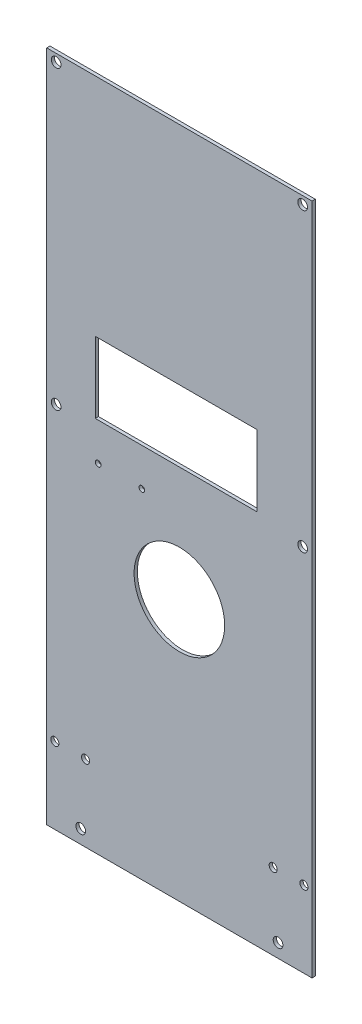
ISO-10303-21;
HEADER;
FILE_DESCRIPTION(('STEP AP214'),'2;1');
FILE_NAME('part.step','',(''),(''),'','','');
FILE_SCHEMA(('AUTOMOTIVE_DESIGN { 1 0 10303 214 1 1 1 1 }'));
ENDSEC;
DATA;
#1=APPLICATION_CONTEXT('core data for automotive mechanical design processes');
#2=APPLICATION_PROTOCOL_DEFINITION('international standard','automotive_design',2000,#1);
#3=PRODUCT_CONTEXT('',#1,'mechanical');
#4=PRODUCT('Part','Part','',(#3));
#5=PRODUCT_RELATED_PRODUCT_CATEGORY('part','',(#4));
#6=PRODUCT_DEFINITION_FORMATION('','',#4);
#7=PRODUCT_DEFINITION_CONTEXT('part definition',#1,'design');
#8=PRODUCT_DEFINITION('design','',#6,#7);
#9=PRODUCT_DEFINITION_SHAPE('','',#8);
#10=(LENGTH_UNIT() NAMED_UNIT(*) SI_UNIT(.MILLI.,.METRE.));
#11=(NAMED_UNIT(*) PLANE_ANGLE_UNIT() SI_UNIT($,.RADIAN.));
#12=(NAMED_UNIT(*) SI_UNIT($,.STERADIAN.) SOLID_ANGLE_UNIT());
#13=UNCERTAINTY_MEASURE_WITH_UNIT(LENGTH_MEASURE(1.E-05),#10,'distance_accuracy_value','');
#14=(GEOMETRIC_REPRESENTATION_CONTEXT(3) GLOBAL_UNCERTAINTY_ASSIGNED_CONTEXT((#13)) GLOBAL_UNIT_ASSIGNED_CONTEXT((#10,
#11,#12)) REPRESENTATION_CONTEXT('',''));
#15=CARTESIAN_POINT('',(0.,0.,0.));
#16=DIRECTION('',(0.,0.,1.));
#17=DIRECTION('',(1.,0.,0.));
#18=AXIS2_PLACEMENT_3D('',#15,#16,#17);
#19=CARTESIAN_POINT('',(-41.,-104.,1.));
#20=DIRECTION('',(1.,0.,0.));
#21=DIRECTION('',(0.,0.,-1.));
#22=AXIS2_PLACEMENT_3D('',#19,#20,#21);
#23=PLANE('',#22);
#24=DIRECTION('',(0.,-1.,0.));
#25=VECTOR('',#24,1.);
#26=CARTESIAN_POINT('',(-41.,-104.,0.));
#27=LINE('',#26,#25);
#28=CARTESIAN_POINT('',(-41.,104.,0.));
#29=VERTEX_POINT('',#28);
#30=CARTESIAN_POINT('',(-41.,-104.,0.));
#31=VERTEX_POINT('',#30);
#32=EDGE_CURVE('E167',#29,#31,#27,.T.);
#33=ORIENTED_EDGE('',*,*,#32,.T.);
#34=DIRECTION('',(0.,0.,-1.));
#35=VECTOR('',#34,1.);
#36=CARTESIAN_POINT('',(-41.,-104.,1.));
#37=LINE('',#36,#35);
#38=CARTESIAN_POINT('',(-41.,-104.,1.));
#39=VERTEX_POINT('',#38);
#40=EDGE_CURVE('E194',#39,#31,#37,.T.);
#41=ORIENTED_EDGE('',*,*,#40,.F.);
#42=DIRECTION('',(0.,-1.,0.));
#43=VECTOR('',#42,1.);
#44=CARTESIAN_POINT('',(-41.,-104.,1.));
#45=LINE('',#44,#43);
#46=CARTESIAN_POINT('',(-41.,104.,1.));
#47=VERTEX_POINT('',#46);
#48=EDGE_CURVE('E168',#47,#39,#45,.T.);
#49=ORIENTED_EDGE('',*,*,#48,.F.);
#50=DIRECTION('',(0.,0.,-1.));
#51=VECTOR('',#50,1.);
#52=CARTESIAN_POINT('',(-41.,104.,1.));
#53=LINE('',#52,#51);
#54=EDGE_CURVE('E178',#47,#29,#53,.T.);
#55=ORIENTED_EDGE('',*,*,#54,.T.);
#56=EDGE_LOOP('',(#33,#41,#49,#55));
#57=FACE_BOUND('',#56,.T.);
#58=ADVANCED_FACE('F35',(#57),#23,.F.);
#59=CARTESIAN_POINT('',(41.,-104.,1.));
#60=DIRECTION('',(0.,1.,0.));
#61=DIRECTION('',(-1.,0.,0.));
#62=AXIS2_PLACEMENT_3D('',#59,#60,#61);
#63=PLANE('',#62);
#64=DIRECTION('',(1.,0.,0.));
#65=VECTOR('',#64,1.);
#66=CARTESIAN_POINT('',(41.,-104.,0.));
#67=LINE('',#66,#65);
#68=CARTESIAN_POINT('',(41.,-104.,0.));
#69=VERTEX_POINT('',#68);
#70=EDGE_CURVE('E181',#31,#69,#67,.T.);
#71=ORIENTED_EDGE('',*,*,#70,.T.);
#72=DIRECTION('',(0.,0.,-1.));
#73=VECTOR('',#72,1.);
#74=CARTESIAN_POINT('',(41.,-104.,1.));
#75=LINE('',#74,#73);
#76=CARTESIAN_POINT('',(41.,-104.,1.));
#77=VERTEX_POINT('',#76);
#78=EDGE_CURVE('E191',#77,#69,#75,.T.);
#79=ORIENTED_EDGE('',*,*,#78,.F.);
#80=DIRECTION('',(1.,0.,0.));
#81=VECTOR('',#80,1.);
#82=CARTESIAN_POINT('',(41.,-104.,1.));
#83=LINE('',#82,#81);
#84=EDGE_CURVE('E171',#39,#77,#83,.T.);
#85=ORIENTED_EDGE('',*,*,#84,.F.);
#86=ORIENTED_EDGE('',*,*,#40,.T.);
#87=EDGE_LOOP('',(#71,#79,#85,#86));
#88=FACE_BOUND('',#87,.T.);
#89=ADVANCED_FACE('F222',(#88),#63,.F.);
#90=CARTESIAN_POINT('',(41.,-104.,1.));
#91=DIRECTION('',(-1.,0.,0.));
#92=DIRECTION('',(0.,0.,1.));
#93=AXIS2_PLACEMENT_3D('',#90,#91,#92);
#94=PLANE('',#93);
#95=DIRECTION('',(0.,1.,0.));
#96=VECTOR('',#95,1.);
#97=CARTESIAN_POINT('',(41.,-104.,0.));
#98=LINE('',#97,#96);
#99=CARTESIAN_POINT('',(41.,104.,0.));
#100=VERTEX_POINT('',#99);
#101=EDGE_CURVE('E183',#69,#100,#98,.T.);
#102=ORIENTED_EDGE('',*,*,#101,.T.);
#103=DIRECTION('',(0.,0.,-1.));
#104=VECTOR('',#103,1.);
#105=CARTESIAN_POINT('',(41.,104.,1.));
#106=LINE('',#105,#104);
#107=CARTESIAN_POINT('',(41.,104.,1.));
#108=VERTEX_POINT('',#107);
#109=EDGE_CURVE('E188',#108,#100,#106,.T.);
#110=ORIENTED_EDGE('',*,*,#109,.F.);
#111=DIRECTION('',(0.,1.,0.));
#112=VECTOR('',#111,1.);
#113=CARTESIAN_POINT('',(41.,-104.,1.));
#114=LINE('',#113,#112);
#115=EDGE_CURVE('E174',#77,#108,#114,.T.);
#116=ORIENTED_EDGE('',*,*,#115,.F.);
#117=ORIENTED_EDGE('',*,*,#78,.T.);
#118=EDGE_LOOP('',(#102,#110,#116,#117));
#119=FACE_BOUND('',#118,.T.);
#120=ADVANCED_FACE('F227',(#119),#94,.F.);
#121=CARTESIAN_POINT('',(41.,104.,1.));
#122=DIRECTION('',(0.,-1.,0.));
#123=DIRECTION('',(0.,0.,-1.));
#124=AXIS2_PLACEMENT_3D('',#121,#122,#123);
#125=PLANE('',#124);
#126=DIRECTION('',(-1.,0.,0.));
#127=VECTOR('',#126,1.);
#128=CARTESIAN_POINT('',(41.,104.,0.));
#129=LINE('',#128,#127);
#130=EDGE_CURVE('E172',#100,#29,#129,.T.);
#131=ORIENTED_EDGE('',*,*,#130,.T.);
#132=ORIENTED_EDGE('',*,*,#54,.F.);
#133=DIRECTION('',(-1.,0.,0.));
#134=VECTOR('',#133,1.);
#135=CARTESIAN_POINT('',(41.,104.,1.));
#136=LINE('',#135,#134);
#137=EDGE_CURVE('E176',#108,#47,#136,.T.);
#138=ORIENTED_EDGE('',*,*,#137,.F.);
#139=ORIENTED_EDGE('',*,*,#109,.T.);
#140=EDGE_LOOP('',(#131,#132,#138,#139));
#141=FACE_BOUND('',#140,.T.);
#142=ADVANCED_FACE('F242',(#141),#125,.F.);
#143=CARTESIAN_POINT('',(0.,0.,1.));
#144=DIRECTION('',(0.,0.,1.));
#145=DIRECTION('',(1.,0.,0.));
#146=AXIS2_PLACEMENT_3D('',#143,#144,#145);
#147=PLANE('',#146);
#148=CARTESIAN_POINT('',(-25.1,0.649999999999291,1.));
#149=DIRECTION('',(0.,0.,1.));
#150=DIRECTION('',(1.,0.,0.));
#151=AXIS2_PLACEMENT_3D('',#148,#149,#150);
#152=CIRCLE('',#151,0.874999999999987);
#153=CARTESIAN_POINT('',(-24.225,0.649999999999291,1.));
#154=VERTEX_POINT('',#153);
#155=EDGE_CURVE('E426',#154,#154,#152,.T.);
#156=ORIENTED_EDGE('',*,*,#155,.F.);
#157=EDGE_LOOP('',(#156));
#158=FACE_BOUND('',#157,.T.);
#159=CARTESIAN_POINT('',(-11.6,0.649999999999292,1.));
#160=DIRECTION('',(0.,0.,1.));
#161=DIRECTION('',(1.,0.,0.));
#162=AXIS2_PLACEMENT_3D('',#159,#160,#161);
#163=CIRCLE('',#162,0.874999999999987);
#164=CARTESIAN_POINT('',(-10.725,0.649999999999292,1.));
#165=VERTEX_POINT('',#164);
#166=EDGE_CURVE('E428',#165,#165,#163,.T.);
#167=ORIENTED_EDGE('',*,*,#166,.F.);
#168=EDGE_LOOP('',(#167));
#169=FACE_BOUND('',#168,.T.);
#170=CARTESIAN_POINT('',(-38.4999999999999,-80.4027964934749,1.));
#171=DIRECTION('',(0.,0.,1.));
#172=DIRECTION('',(1.,0.,0.));
#173=AXIS2_PLACEMENT_3D('',#170,#171,#172);
#174=CIRCLE('',#173,1.24999999999999);
#175=CARTESIAN_POINT('',(-37.25,-80.4027964934749,1.));
#176=VERTEX_POINT('',#175);
#177=EDGE_CURVE('E436',#176,#176,#174,.T.);
#178=ORIENTED_EDGE('',*,*,#177,.F.);
#179=EDGE_LOOP('',(#178));
#180=FACE_BOUND('',#179,.T.);
#181=CARTESIAN_POINT('',(-28.9999999999999,-80.4027964934749,1.));
#182=DIRECTION('',(0.,0.,1.));
#183=DIRECTION('',(1.,0.,0.));
#184=AXIS2_PLACEMENT_3D('',#181,#182,#183);
#185=CIRCLE('',#184,1.24999999999999);
#186=CARTESIAN_POINT('',(-27.7499999999999,-80.4027964934749,1.));
#187=VERTEX_POINT('',#186);
#188=EDGE_CURVE('E442',#187,#187,#185,.T.);
#189=ORIENTED_EDGE('',*,*,#188,.F.);
#190=EDGE_LOOP('',(#189));
#191=FACE_BOUND('',#190,.T.);
#192=CARTESIAN_POINT('',(29.0000000000001,-80.4027964934749,1.));
#193=DIRECTION('',(0.,0.,1.));
#194=DIRECTION('',(1.,0.,0.));
#195=AXIS2_PLACEMENT_3D('',#192,#193,#194);
#196=CIRCLE('',#195,1.24999999999999);
#197=CARTESIAN_POINT('',(30.2500000000001,-80.4027964934749,1.));
#198=VERTEX_POINT('',#197);
#199=EDGE_CURVE('E448',#198,#198,#196,.T.);
#200=ORIENTED_EDGE('',*,*,#199,.F.);
#201=EDGE_LOOP('',(#200));
#202=FACE_BOUND('',#201,.T.);
#203=CARTESIAN_POINT('',(38.5000000000001,-80.4027964934749,1.));
#204=DIRECTION('',(0.,0.,1.));
#205=DIRECTION('',(1.,0.,0.));
#206=AXIS2_PLACEMENT_3D('',#203,#204,#205);
#207=CIRCLE('',#206,1.24999999999999);
#208=CARTESIAN_POINT('',(39.7500000000001,-80.4027964934749,1.));
#209=VERTEX_POINT('',#208);
#210=EDGE_CURVE('E454',#209,#209,#207,.T.);
#211=ORIENTED_EDGE('',*,*,#210,.F.);
#212=EDGE_LOOP('',(#211));
#213=FACE_BOUND('',#212,.T.);
#214=DIRECTION('',(0.,-1.,0.));
#215=VECTOR('',#214,1.);
#216=CARTESIAN_POINT('',(-26.,12.3,1.));
#217=LINE('',#216,#215);
#218=CARTESIAN_POINT('',(-26.,34.3,1.));
#219=VERTEX_POINT('',#218);
#220=CARTESIAN_POINT('',(-26.,12.3,1.));
#221=VERTEX_POINT('',#220);
#222=EDGE_CURVE('E49',#219,#221,#217,.T.);
#223=ORIENTED_EDGE('',*,*,#222,.F.);
#224=DIRECTION('',(-1.,0.,0.));
#225=VECTOR('',#224,1.);
#226=CARTESIAN_POINT('',(-26.,34.3,1.));
#227=LINE('',#226,#225);
#228=CARTESIAN_POINT('',(24.,34.3,1.));
#229=VERTEX_POINT('',#228);
#230=EDGE_CURVE('E118',#229,#219,#227,.T.);
#231=ORIENTED_EDGE('',*,*,#230,.F.);
#232=DIRECTION('',(0.,1.,0.));
#233=VECTOR('',#232,1.);
#234=CARTESIAN_POINT('',(24.,12.3,1.));
#235=LINE('',#234,#233);
#236=CARTESIAN_POINT('',(24.,12.3,1.));
#237=VERTEX_POINT('',#236);
#238=EDGE_CURVE('E102',#237,#229,#235,.T.);
#239=ORIENTED_EDGE('',*,*,#238,.F.);
#240=DIRECTION('',(1.,0.,0.));
#241=VECTOR('',#240,1.);
#242=CARTESIAN_POINT('',(-26.,12.3,1.));
#243=LINE('',#242,#241);
#244=EDGE_CURVE('E111',#221,#237,#243,.T.);
#245=ORIENTED_EDGE('',*,*,#244,.F.);
#246=EDGE_LOOP('',(#223,#231,#239,#245));
#247=FACE_BOUND('',#246,.T.);
#248=CARTESIAN_POINT('',(6.34145513878082E-11,-23.1500000000007,1.));
#249=DIRECTION('',(0.,0.,1.));
#250=DIRECTION('',(1.,0.,0.));
#251=AXIS2_PLACEMENT_3D('',#248,#249,#250);
#252=CIRCLE('',#251,14.);
#253=CARTESIAN_POINT('',(14.0000000000634,-23.1500000000007,1.));
#254=VERTEX_POINT('',#253);
#255=EDGE_CURVE('E125',#254,#254,#252,.T.);
#256=ORIENTED_EDGE('',*,*,#255,.F.);
#257=EDGE_LOOP('',(#256));
#258=FACE_BOUND('',#257,.T.);
#259=CARTESIAN_POINT('',(-38.1,9.9999999999993,1.));
#260=DIRECTION('',(0.,0.,1.));
#261=DIRECTION('',(1.,0.,0.));
#262=AXIS2_PLACEMENT_3D('',#259,#260,#261);
#263=CIRCLE('',#262,1.5);
#264=CARTESIAN_POINT('',(-36.6,9.9999999999993,1.));
#265=VERTEX_POINT('',#264);
#266=EDGE_CURVE('E131',#265,#265,#263,.T.);
#267=ORIENTED_EDGE('',*,*,#266,.F.);
#268=EDGE_LOOP('',(#267));
#269=FACE_BOUND('',#268,.T.);
#270=CARTESIAN_POINT('',(38.1,9.99999999999927,1.));
#271=DIRECTION('',(0.,0.,1.));
#272=DIRECTION('',(1.,0.,0.));
#273=AXIS2_PLACEMENT_3D('',#270,#271,#272);
#274=CIRCLE('',#273,1.5);
#275=CARTESIAN_POINT('',(39.6,9.99999999999927,1.));
#276=VERTEX_POINT('',#275);
#277=EDGE_CURVE('E137',#276,#276,#274,.T.);
#278=ORIENTED_EDGE('',*,*,#277,.F.);
#279=EDGE_LOOP('',(#278));
#280=FACE_BOUND('',#279,.T.);
#281=CARTESIAN_POINT('',(30.5000000000074,-99.75,1.));
#282=DIRECTION('',(0.,0.,1.));
#283=DIRECTION('',(1.,0.,0.));
#284=AXIS2_PLACEMENT_3D('',#281,#282,#283);
#285=CIRCLE('',#284,1.5);
#286=CARTESIAN_POINT('',(32.0000000000074,-99.75,1.));
#287=VERTEX_POINT('',#286);
#288=EDGE_CURVE('E143',#287,#287,#285,.T.);
#289=ORIENTED_EDGE('',*,*,#288,.F.);
#290=EDGE_LOOP('',(#289));
#291=FACE_BOUND('',#290,.T.);
#292=CARTESIAN_POINT('',(-30.4999999999927,-99.7499999999999,1.));
#293=DIRECTION('',(0.,0.,1.));
#294=DIRECTION('',(1.,0.,0.));
#295=AXIS2_PLACEMENT_3D('',#292,#293,#294);
#296=CIRCLE('',#295,1.5);
#297=CARTESIAN_POINT('',(-28.9999999999927,-99.7499999999999,1.));
#298=VERTEX_POINT('',#297);
#299=EDGE_CURVE('E149',#298,#298,#296,.T.);
#300=ORIENTED_EDGE('',*,*,#299,.F.);
#301=EDGE_LOOP('',(#300));
#302=FACE_BOUND('',#301,.T.);
#303=CARTESIAN_POINT('',(-38.1,101.599999679999,1.));
#304=DIRECTION('',(0.,0.,1.));
#305=DIRECTION('',(1.,0.,0.));
#306=AXIS2_PLACEMENT_3D('',#303,#304,#305);
#307=CIRCLE('',#306,1.5);
#308=CARTESIAN_POINT('',(-36.6,101.599999679999,1.));
#309=VERTEX_POINT('',#308);
#310=EDGE_CURVE('E155',#309,#309,#307,.T.);
#311=ORIENTED_EDGE('',*,*,#310,.F.);
#312=EDGE_LOOP('',(#311));
#313=FACE_BOUND('',#312,.T.);
#314=CARTESIAN_POINT('',(38.1,101.599999679999,1.));
#315=DIRECTION('',(0.,0.,1.));
#316=DIRECTION('',(1.,0.,0.));
#317=AXIS2_PLACEMENT_3D('',#314,#315,#316);
#318=CIRCLE('',#317,1.5);
#319=CARTESIAN_POINT('',(39.6,101.599999679999,1.));
#320=VERTEX_POINT('',#319);
#321=EDGE_CURVE('E161',#320,#320,#318,.T.);
#322=ORIENTED_EDGE('',*,*,#321,.F.);
#323=EDGE_LOOP('',(#322));
#324=FACE_BOUND('',#323,.T.);
#325=ORIENTED_EDGE('',*,*,#48,.T.);
#326=ORIENTED_EDGE('',*,*,#84,.T.);
#327=ORIENTED_EDGE('',*,*,#115,.T.);
#328=ORIENTED_EDGE('',*,*,#137,.T.);
#329=EDGE_LOOP('',(#325,#326,#327,#328));
#330=FACE_BOUND('',#329,.T.);
#331=ADVANCED_FACE('F115',(#158,#169,#180,#191,#202,#213,#247,#258,#269,#280,#291,#302,#313,
#324,#330),#147,.T.);
#332=CARTESIAN_POINT('',(0.,0.,0.));
#333=DIRECTION('',(0.,0.,1.));
#334=DIRECTION('',(1.,0.,0.));
#335=AXIS2_PLACEMENT_3D('',#332,#333,#334);
#336=PLANE('',#335);
#337=CARTESIAN_POINT('',(-25.1,0.649999999999291,0.));
#338=DIRECTION('',(0.,0.,1.));
#339=DIRECTION('',(1.,0.,0.));
#340=AXIS2_PLACEMENT_3D('',#337,#338,#339);
#341=CIRCLE('',#340,0.874999999999997);
#342=CARTESIAN_POINT('',(-24.225,0.649999999999291,0.));
#343=VERTEX_POINT('',#342);
#344=EDGE_CURVE('E423',#343,#343,#341,.T.);
#345=ORIENTED_EDGE('',*,*,#344,.T.);
#346=EDGE_LOOP('',(#345));
#347=FACE_BOUND('',#346,.T.);
#348=CARTESIAN_POINT('',(-11.6,0.649999999999292,0.));
#349=DIRECTION('',(0.,0.,1.));
#350=DIRECTION('',(1.,0.,0.));
#351=AXIS2_PLACEMENT_3D('',#348,#349,#350);
#352=CIRCLE('',#351,0.874999999999999);
#353=CARTESIAN_POINT('',(-10.725,0.649999999999292,0.));
#354=VERTEX_POINT('',#353);
#355=EDGE_CURVE('E433',#354,#354,#352,.T.);
#356=ORIENTED_EDGE('',*,*,#355,.T.);
#357=EDGE_LOOP('',(#356));
#358=FACE_BOUND('',#357,.T.);
#359=CARTESIAN_POINT('',(-38.4999999999999,-80.4027964934749,0.));
#360=DIRECTION('',(0.,0.,1.));
#361=DIRECTION('',(1.,0.,0.));
#362=AXIS2_PLACEMENT_3D('',#359,#360,#361);
#363=CIRCLE('',#362,1.25);
#364=CARTESIAN_POINT('',(-37.2499999999999,-80.4027964934749,0.));
#365=VERTEX_POINT('',#364);
#366=EDGE_CURVE('E439',#365,#365,#363,.T.);
#367=ORIENTED_EDGE('',*,*,#366,.T.);
#368=EDGE_LOOP('',(#367));
#369=FACE_BOUND('',#368,.T.);
#370=CARTESIAN_POINT('',(-28.9999999999999,-80.4027964934749,0.));
#371=DIRECTION('',(0.,0.,1.));
#372=DIRECTION('',(1.,0.,0.));
#373=AXIS2_PLACEMENT_3D('',#370,#371,#372);
#374=CIRCLE('',#373,1.25);
#375=CARTESIAN_POINT('',(-27.7499999999999,-80.4027964934749,0.));
#376=VERTEX_POINT('',#375);
#377=EDGE_CURVE('E445',#376,#376,#374,.T.);
#378=ORIENTED_EDGE('',*,*,#377,.T.);
#379=EDGE_LOOP('',(#378));
#380=FACE_BOUND('',#379,.T.);
#381=CARTESIAN_POINT('',(29.0000000000001,-80.4027964934749,0.));
#382=DIRECTION('',(0.,0.,1.));
#383=DIRECTION('',(1.,0.,0.));
#384=AXIS2_PLACEMENT_3D('',#381,#382,#383);
#385=CIRCLE('',#384,1.25);
#386=CARTESIAN_POINT('',(30.2500000000001,-80.4027964934749,0.));
#387=VERTEX_POINT('',#386);
#388=EDGE_CURVE('E451',#387,#387,#385,.T.);
#389=ORIENTED_EDGE('',*,*,#388,.T.);
#390=EDGE_LOOP('',(#389));
#391=FACE_BOUND('',#390,.T.);
#392=CARTESIAN_POINT('',(38.5000000000001,-80.4027964934749,0.));
#393=DIRECTION('',(0.,0.,1.));
#394=DIRECTION('',(1.,0.,0.));
#395=AXIS2_PLACEMENT_3D('',#392,#393,#394);
#396=CIRCLE('',#395,1.25);
#397=CARTESIAN_POINT('',(39.7500000000001,-80.4027964934749,0.));
#398=VERTEX_POINT('',#397);
#399=EDGE_CURVE('E457',#398,#398,#396,.T.);
#400=ORIENTED_EDGE('',*,*,#399,.T.);
#401=EDGE_LOOP('',(#400));
#402=FACE_BOUND('',#401,.T.);
#403=DIRECTION('',(-1.,0.,0.));
#404=VECTOR('',#403,1.);
#405=CARTESIAN_POINT('',(0.,34.3,0.));
#406=LINE('',#405,#404);
#407=CARTESIAN_POINT('',(24.,34.3,0.));
#408=VERTEX_POINT('',#407);
#409=CARTESIAN_POINT('',(-26.,34.3,0.));
#410=VERTEX_POINT('',#409);
#411=EDGE_CURVE('E42',#408,#410,#406,.T.);
#412=ORIENTED_EDGE('',*,*,#411,.T.);
#413=DIRECTION('',(0.,-1.,0.));
#414=VECTOR('',#413,1.);
#415=CARTESIAN_POINT('',(-26.,0.,0.));
#416=LINE('',#415,#414);
#417=CARTESIAN_POINT('',(-26.,12.3,0.));
#418=VERTEX_POINT('',#417);
#419=EDGE_CURVE('E11',#410,#418,#416,.T.);
#420=ORIENTED_EDGE('',*,*,#419,.T.);
#421=DIRECTION('',(1.,0.,0.));
#422=VECTOR('',#421,1.);
#423=CARTESIAN_POINT('',(0.,12.3,0.));
#424=LINE('',#423,#422);
#425=CARTESIAN_POINT('',(24.,12.3,0.));
#426=VERTEX_POINT('',#425);
#427=EDGE_CURVE('E197',#418,#426,#424,.T.);
#428=ORIENTED_EDGE('',*,*,#427,.T.);
#429=DIRECTION('',(0.,1.,0.));
#430=VECTOR('',#429,1.);
#431=CARTESIAN_POINT('',(24.,0.,0.));
#432=LINE('',#431,#430);
#433=EDGE_CURVE('E105',#426,#408,#432,.T.);
#434=ORIENTED_EDGE('',*,*,#433,.T.);
#435=EDGE_LOOP('',(#412,#420,#428,#434));
#436=FACE_BOUND('',#435,.T.);
#437=CARTESIAN_POINT('',(6.34145513878082E-11,-23.1500000000007,0.));
#438=DIRECTION('',(0.,0.,1.));
#439=DIRECTION('',(1.,0.,0.));
#440=AXIS2_PLACEMENT_3D('',#437,#438,#439);
#441=CIRCLE('',#440,14.);
#442=CARTESIAN_POINT('',(14.0000000000634,-23.1500000000007,0.));
#443=VERTEX_POINT('',#442);
#444=EDGE_CURVE('E130',#443,#443,#441,.T.);
#445=ORIENTED_EDGE('',*,*,#444,.T.);
#446=EDGE_LOOP('',(#445));
#447=FACE_BOUND('',#446,.T.);
#448=CARTESIAN_POINT('',(-38.1,9.9999999999993,0.));
#449=DIRECTION('',(0.,0.,1.));
#450=DIRECTION('',(1.,0.,0.));
#451=AXIS2_PLACEMENT_3D('',#448,#449,#450);
#452=CIRCLE('',#451,1.5);
#453=CARTESIAN_POINT('',(-36.6,9.9999999999993,0.));
#454=VERTEX_POINT('',#453);
#455=EDGE_CURVE('E134',#454,#454,#452,.T.);
#456=ORIENTED_EDGE('',*,*,#455,.T.);
#457=EDGE_LOOP('',(#456));
#458=FACE_BOUND('',#457,.T.);
#459=CARTESIAN_POINT('',(38.1,9.99999999999927,0.));
#460=DIRECTION('',(0.,0.,1.));
#461=DIRECTION('',(1.,0.,0.));
#462=AXIS2_PLACEMENT_3D('',#459,#460,#461);
#463=CIRCLE('',#462,1.5);
#464=CARTESIAN_POINT('',(39.6,9.99999999999927,0.));
#465=VERTEX_POINT('',#464);
#466=EDGE_CURVE('E140',#465,#465,#463,.T.);
#467=ORIENTED_EDGE('',*,*,#466,.T.);
#468=EDGE_LOOP('',(#467));
#469=FACE_BOUND('',#468,.T.);
#470=CARTESIAN_POINT('',(30.5000000000074,-99.75,0.));
#471=DIRECTION('',(0.,0.,1.));
#472=DIRECTION('',(1.,0.,0.));
#473=AXIS2_PLACEMENT_3D('',#470,#471,#472);
#474=CIRCLE('',#473,1.5);
#475=CARTESIAN_POINT('',(32.0000000000074,-99.75,0.));
#476=VERTEX_POINT('',#475);
#477=EDGE_CURVE('E146',#476,#476,#474,.T.);
#478=ORIENTED_EDGE('',*,*,#477,.T.);
#479=EDGE_LOOP('',(#478));
#480=FACE_BOUND('',#479,.T.);
#481=CARTESIAN_POINT('',(-30.4999999999927,-99.7499999999999,0.));
#482=DIRECTION('',(0.,0.,1.));
#483=DIRECTION('',(1.,0.,0.));
#484=AXIS2_PLACEMENT_3D('',#481,#482,#483);
#485=CIRCLE('',#484,1.5);
#486=CARTESIAN_POINT('',(-28.9999999999927,-99.7499999999999,0.));
#487=VERTEX_POINT('',#486);
#488=EDGE_CURVE('E152',#487,#487,#485,.T.);
#489=ORIENTED_EDGE('',*,*,#488,.T.);
#490=EDGE_LOOP('',(#489));
#491=FACE_BOUND('',#490,.T.);
#492=CARTESIAN_POINT('',(-38.1,101.599999679999,0.));
#493=DIRECTION('',(0.,0.,1.));
#494=DIRECTION('',(1.,0.,0.));
#495=AXIS2_PLACEMENT_3D('',#492,#493,#494);
#496=CIRCLE('',#495,1.5);
#497=CARTESIAN_POINT('',(-36.6,101.599999679999,0.));
#498=VERTEX_POINT('',#497);
#499=EDGE_CURVE('E158',#498,#498,#496,.T.);
#500=ORIENTED_EDGE('',*,*,#499,.T.);
#501=EDGE_LOOP('',(#500));
#502=FACE_BOUND('',#501,.T.);
#503=CARTESIAN_POINT('',(38.1,101.599999679999,0.));
#504=DIRECTION('',(0.,0.,1.));
#505=DIRECTION('',(1.,0.,0.));
#506=AXIS2_PLACEMENT_3D('',#503,#504,#505);
#507=CIRCLE('',#506,1.5);
#508=CARTESIAN_POINT('',(39.6,101.599999679999,0.));
#509=VERTEX_POINT('',#508);
#510=EDGE_CURVE('E164',#509,#509,#507,.T.);
#511=ORIENTED_EDGE('',*,*,#510,.T.);
#512=EDGE_LOOP('',(#511));
#513=FACE_BOUND('',#512,.T.);
#514=ORIENTED_EDGE('',*,*,#32,.F.);
#515=ORIENTED_EDGE('',*,*,#130,.F.);
#516=ORIENTED_EDGE('',*,*,#101,.F.);
#517=ORIENTED_EDGE('',*,*,#70,.F.);
#518=EDGE_LOOP('',(#514,#515,#516,#517));
#519=FACE_BOUND('',#518,.T.);
#520=ADVANCED_FACE('F203',(#347,#358,#369,#380,#391,#402,#436,#447,#458,#469,#480,#491,#502,
#513,#519),#336,.F.);
#521=CARTESIAN_POINT('',(38.1,101.599999679999,1.));
#522=DIRECTION('',(0.,0.,1.));
#523=DIRECTION('',(1.,0.,0.));
#524=AXIS2_PLACEMENT_3D('',#521,#522,#523);
#525=CYLINDRICAL_SURFACE('',#524,1.5);
#526=ORIENTED_EDGE('',*,*,#510,.F.);
#527=EDGE_LOOP('',(#526));
#528=FACE_BOUND('',#527,.T.);
#529=ORIENTED_EDGE('',*,*,#321,.T.);
#530=EDGE_LOOP('',(#529));
#531=FACE_BOUND('',#530,.T.);
#532=ADVANCED_FACE('F253',(#528,#531),#525,.F.);
#533=CARTESIAN_POINT('',(-38.1,101.599999679999,1.));
#534=DIRECTION('',(0.,0.,1.));
#535=DIRECTION('',(1.,0.,0.));
#536=AXIS2_PLACEMENT_3D('',#533,#534,#535);
#537=CYLINDRICAL_SURFACE('',#536,1.5);
#538=ORIENTED_EDGE('',*,*,#499,.F.);
#539=EDGE_LOOP('',(#538));
#540=FACE_BOUND('',#539,.T.);
#541=ORIENTED_EDGE('',*,*,#310,.T.);
#542=EDGE_LOOP('',(#541));
#543=FACE_BOUND('',#542,.T.);
#544=ADVANCED_FACE('F260',(#540,#543),#537,.F.);
#545=CARTESIAN_POINT('',(-30.4999999999927,-99.7499999999999,1.));
#546=DIRECTION('',(0.,0.,1.));
#547=DIRECTION('',(1.,0.,0.));
#548=AXIS2_PLACEMENT_3D('',#545,#546,#547);
#549=CYLINDRICAL_SURFACE('',#548,1.5);
#550=ORIENTED_EDGE('',*,*,#488,.F.);
#551=EDGE_LOOP('',(#550));
#552=FACE_BOUND('',#551,.T.);
#553=ORIENTED_EDGE('',*,*,#299,.T.);
#554=EDGE_LOOP('',(#553));
#555=FACE_BOUND('',#554,.T.);
#556=ADVANCED_FACE('F264',(#552,#555),#549,.F.);
#557=CARTESIAN_POINT('',(30.5000000000074,-99.75,1.));
#558=DIRECTION('',(0.,0.,1.));
#559=DIRECTION('',(1.,0.,0.));
#560=AXIS2_PLACEMENT_3D('',#557,#558,#559);
#561=CYLINDRICAL_SURFACE('',#560,1.5);
#562=ORIENTED_EDGE('',*,*,#477,.F.);
#563=EDGE_LOOP('',(#562));
#564=FACE_BOUND('',#563,.T.);
#565=ORIENTED_EDGE('',*,*,#288,.T.);
#566=EDGE_LOOP('',(#565));
#567=FACE_BOUND('',#566,.T.);
#568=ADVANCED_FACE('F268',(#564,#567),#561,.F.);
#569=CARTESIAN_POINT('',(38.1,9.99999999999927,1.));
#570=DIRECTION('',(0.,0.,1.));
#571=DIRECTION('',(1.,0.,0.));
#572=AXIS2_PLACEMENT_3D('',#569,#570,#571);
#573=CYLINDRICAL_SURFACE('',#572,1.5);
#574=ORIENTED_EDGE('',*,*,#466,.F.);
#575=EDGE_LOOP('',(#574));
#576=FACE_BOUND('',#575,.T.);
#577=ORIENTED_EDGE('',*,*,#277,.T.);
#578=EDGE_LOOP('',(#577));
#579=FACE_BOUND('',#578,.T.);
#580=ADVANCED_FACE('F272',(#576,#579),#573,.F.);
#581=CARTESIAN_POINT('',(-38.1,9.9999999999993,1.));
#582=DIRECTION('',(0.,0.,1.));
#583=DIRECTION('',(1.,0.,0.));
#584=AXIS2_PLACEMENT_3D('',#581,#582,#583);
#585=CYLINDRICAL_SURFACE('',#584,1.5);
#586=ORIENTED_EDGE('',*,*,#455,.F.);
#587=EDGE_LOOP('',(#586));
#588=FACE_BOUND('',#587,.T.);
#589=ORIENTED_EDGE('',*,*,#266,.T.);
#590=EDGE_LOOP('',(#589));
#591=FACE_BOUND('',#590,.T.);
#592=ADVANCED_FACE('F217',(#588,#591),#585,.F.);
#593=CARTESIAN_POINT('',(6.34145513878082E-11,-23.1500000000007,-9.));
#594=DIRECTION('',(0.,0.,1.));
#595=DIRECTION('',(1.,0.,0.));
#596=AXIS2_PLACEMENT_3D('',#593,#594,#595);
#597=CYLINDRICAL_SURFACE('',#596,14.);
#598=ORIENTED_EDGE('',*,*,#255,.T.);
#599=EDGE_LOOP('',(#598));
#600=FACE_BOUND('',#599,.T.);
#601=ORIENTED_EDGE('',*,*,#444,.F.);
#602=EDGE_LOOP('',(#601));
#603=FACE_BOUND('',#602,.T.);
#604=ADVANCED_FACE('F210',(#600,#603),#597,.F.);
#605=CARTESIAN_POINT('',(-26.,12.3,-9.));
#606=DIRECTION('',(-1.,0.,0.));
#607=DIRECTION('',(0.,0.,1.));
#608=AXIS2_PLACEMENT_3D('',#605,#606,#607);
#609=PLANE('',#608);
#610=DIRECTION('',(0.,0.,1.));
#611=VECTOR('',#610,1.);
#612=CARTESIAN_POINT('',(-26.,34.3,-9.));
#613=LINE('',#612,#611);
#614=EDGE_CURVE('E123',#410,#219,#613,.T.);
#615=ORIENTED_EDGE('',*,*,#614,.T.);
#616=ORIENTED_EDGE('',*,*,#222,.T.);
#617=DIRECTION('',(0.,0.,1.));
#618=VECTOR('',#617,1.);
#619=CARTESIAN_POINT('',(-26.,12.3,-9.));
#620=LINE('',#619,#618);
#621=EDGE_CURVE('E108',#418,#221,#620,.T.);
#622=ORIENTED_EDGE('',*,*,#621,.F.);
#623=ORIENTED_EDGE('',*,*,#419,.F.);
#624=EDGE_LOOP('',(#615,#616,#622,#623));
#625=FACE_BOUND('',#624,.T.);
#626=ADVANCED_FACE('F208',(#625),#609,.F.);
#627=CARTESIAN_POINT('',(-26.,34.3,-9.));
#628=DIRECTION('',(0.,1.,0.));
#629=DIRECTION('',(0.,0.,1.));
#630=AXIS2_PLACEMENT_3D('',#627,#628,#629);
#631=PLANE('',#630);
#632=DIRECTION('',(0.,0.,1.));
#633=VECTOR('',#632,1.);
#634=CARTESIAN_POINT('',(24.,34.3,-9.));
#635=LINE('',#634,#633);
#636=EDGE_CURVE('E107',#408,#229,#635,.T.);
#637=ORIENTED_EDGE('',*,*,#636,.T.);
#638=ORIENTED_EDGE('',*,*,#230,.T.);
#639=ORIENTED_EDGE('',*,*,#614,.F.);
#640=ORIENTED_EDGE('',*,*,#411,.F.);
#641=EDGE_LOOP('',(#637,#638,#639,#640));
#642=FACE_BOUND('',#641,.T.);
#643=ADVANCED_FACE('F207',(#642),#631,.F.);
#644=CARTESIAN_POINT('',(24.,12.3,-9.));
#645=DIRECTION('',(1.,0.,0.));
#646=DIRECTION('',(0.,0.,-1.));
#647=AXIS2_PLACEMENT_3D('',#644,#645,#646);
#648=PLANE('',#647);
#649=DIRECTION('',(0.,0.,1.));
#650=VECTOR('',#649,1.);
#651=CARTESIAN_POINT('',(24.,12.3,-9.));
#652=LINE('',#651,#650);
#653=EDGE_CURVE('E57',#426,#237,#652,.T.);
#654=ORIENTED_EDGE('',*,*,#653,.T.);
#655=ORIENTED_EDGE('',*,*,#238,.T.);
#656=ORIENTED_EDGE('',*,*,#636,.F.);
#657=ORIENTED_EDGE('',*,*,#433,.F.);
#658=EDGE_LOOP('',(#654,#655,#656,#657));
#659=FACE_BOUND('',#658,.T.);
#660=ADVANCED_FACE('F99',(#659),#648,.F.);
#661=CARTESIAN_POINT('',(-26.,12.3,-9.));
#662=DIRECTION('',(0.,-1.,0.));
#663=DIRECTION('',(0.,0.,-1.));
#664=AXIS2_PLACEMENT_3D('',#661,#662,#663);
#665=PLANE('',#664);
#666=ORIENTED_EDGE('',*,*,#621,.T.);
#667=ORIENTED_EDGE('',*,*,#244,.T.);
#668=ORIENTED_EDGE('',*,*,#653,.F.);
#669=ORIENTED_EDGE('',*,*,#427,.F.);
#670=EDGE_LOOP('',(#666,#667,#668,#669));
#671=FACE_BOUND('',#670,.T.);
#672=ADVANCED_FACE('F112',(#671),#665,.F.);
#673=CARTESIAN_POINT('',(38.5000000000001,-80.4027964934749,1.));
#674=DIRECTION('',(0.,0.,1.));
#675=DIRECTION('',(1.,0.,0.));
#676=AXIS2_PLACEMENT_3D('',#673,#674,#675);
#677=CYLINDRICAL_SURFACE('',#676,1.24999999999999);
#678=ORIENTED_EDGE('',*,*,#399,.F.);
#679=EDGE_LOOP('',(#678));
#680=FACE_BOUND('',#679,.T.);
#681=ORIENTED_EDGE('',*,*,#210,.T.);
#682=EDGE_LOOP('',(#681));
#683=FACE_BOUND('',#682,.T.);
#684=ADVANCED_FACE('F344',(#680,#683),#677,.F.);
#685=CARTESIAN_POINT('',(29.0000000000001,-80.4027964934749,1.));
#686=DIRECTION('',(0.,0.,1.));
#687=DIRECTION('',(1.,0.,0.));
#688=AXIS2_PLACEMENT_3D('',#685,#686,#687);
#689=CYLINDRICAL_SURFACE('',#688,1.24999999999999);
#690=ORIENTED_EDGE('',*,*,#388,.F.);
#691=EDGE_LOOP('',(#690));
#692=FACE_BOUND('',#691,.T.);
#693=ORIENTED_EDGE('',*,*,#199,.T.);
#694=EDGE_LOOP('',(#693));
#695=FACE_BOUND('',#694,.T.);
#696=ADVANCED_FACE('F352',(#692,#695),#689,.F.);
#697=CARTESIAN_POINT('',(-28.9999999999999,-80.4027964934749,1.));
#698=DIRECTION('',(0.,0.,1.));
#699=DIRECTION('',(1.,0.,0.));
#700=AXIS2_PLACEMENT_3D('',#697,#698,#699);
#701=CYLINDRICAL_SURFACE('',#700,1.24999999999999);
#702=ORIENTED_EDGE('',*,*,#377,.F.);
#703=EDGE_LOOP('',(#702));
#704=FACE_BOUND('',#703,.T.);
#705=ORIENTED_EDGE('',*,*,#188,.T.);
#706=EDGE_LOOP('',(#705));
#707=FACE_BOUND('',#706,.T.);
#708=ADVANCED_FACE('F362',(#704,#707),#701,.F.);
#709=CARTESIAN_POINT('',(-38.4999999999999,-80.4027964934749,1.));
#710=DIRECTION('',(0.,0.,1.));
#711=DIRECTION('',(1.,0.,0.));
#712=AXIS2_PLACEMENT_3D('',#709,#710,#711);
#713=CYLINDRICAL_SURFACE('',#712,1.24999999999999);
#714=ORIENTED_EDGE('',*,*,#366,.F.);
#715=EDGE_LOOP('',(#714));
#716=FACE_BOUND('',#715,.T.);
#717=ORIENTED_EDGE('',*,*,#177,.T.);
#718=EDGE_LOOP('',(#717));
#719=FACE_BOUND('',#718,.T.);
#720=ADVANCED_FACE('F372',(#716,#719),#713,.F.);
#721=CARTESIAN_POINT('',(-11.6,0.649999999999292,1.));
#722=DIRECTION('',(0.,0.,1.));
#723=DIRECTION('',(1.,0.,0.));
#724=AXIS2_PLACEMENT_3D('',#721,#722,#723);
#725=CYLINDRICAL_SURFACE('',#724,0.874999999999993);
#726=ORIENTED_EDGE('',*,*,#355,.F.);
#727=EDGE_LOOP('',(#726));
#728=FACE_BOUND('',#727,.T.);
#729=ORIENTED_EDGE('',*,*,#166,.T.);
#730=EDGE_LOOP('',(#729));
#731=FACE_BOUND('',#730,.T.);
#732=ADVANCED_FACE('F382',(#728,#731),#725,.F.);
#733=CARTESIAN_POINT('',(-25.1,0.649999999999291,1.));
#734=DIRECTION('',(0.,0.,1.));
#735=DIRECTION('',(1.,0.,0.));
#736=AXIS2_PLACEMENT_3D('',#733,#734,#735);
#737=CYLINDRICAL_SURFACE('',#736,0.874999999999992);
#738=ORIENTED_EDGE('',*,*,#344,.F.);
#739=EDGE_LOOP('',(#738));
#740=FACE_BOUND('',#739,.T.);
#741=ORIENTED_EDGE('',*,*,#155,.T.);
#742=EDGE_LOOP('',(#741));
#743=FACE_BOUND('',#742,.T.);
#744=ADVANCED_FACE('F406',(#740,#743),#737,.F.);
#745=CLOSED_SHELL('',(#58,#89,#120,#142,#331,#520,#532,#544,#556,#568,#580,#592,#604,#626,#643,
#660,#672,#684,#696,#708,#720,#732,#744));
#746=MANIFOLD_SOLID_BREP('B2',#745);
#747=ADVANCED_BREP_SHAPE_REPRESENTATION('',(#18,#746),#14);
#748=SHAPE_DEFINITION_REPRESENTATION(#9,#747);
ENDSEC;
END-ISO-10303-21;
